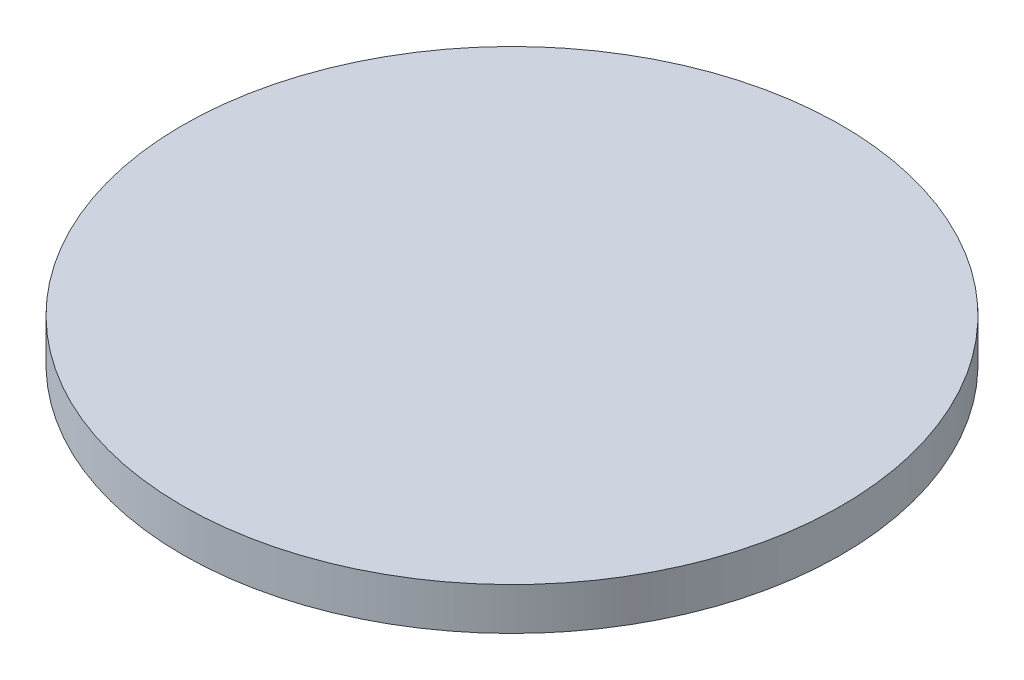
ISO-10303-21;
HEADER;
FILE_DESCRIPTION(('STEP AP214'),'2;1');
FILE_NAME('part.step','',(''),(''),'','','');
FILE_SCHEMA(('AUTOMOTIVE_DESIGN { 1 0 10303 214 1 1 1 1 }'));
ENDSEC;
DATA;
#1=APPLICATION_CONTEXT('core data for automotive mechanical design processes');
#2=APPLICATION_PROTOCOL_DEFINITION('international standard','automotive_design',2000,#1);
#3=PRODUCT_CONTEXT('',#1,'mechanical');
#4=PRODUCT('Part','Part','',(#3));
#5=PRODUCT_RELATED_PRODUCT_CATEGORY('part','',(#4));
#6=PRODUCT_DEFINITION_FORMATION('','',#4);
#7=PRODUCT_DEFINITION_CONTEXT('part definition',#1,'design');
#8=PRODUCT_DEFINITION('design','',#6,#7);
#9=PRODUCT_DEFINITION_SHAPE('','',#8);
#10=(LENGTH_UNIT() NAMED_UNIT(*) SI_UNIT(.MILLI.,.METRE.));
#11=(NAMED_UNIT(*) PLANE_ANGLE_UNIT() SI_UNIT($,.RADIAN.));
#12=(NAMED_UNIT(*) SI_UNIT($,.STERADIAN.) SOLID_ANGLE_UNIT());
#13=UNCERTAINTY_MEASURE_WITH_UNIT(LENGTH_MEASURE(1.E-05),#10,'distance_accuracy_value','');
#14=(GEOMETRIC_REPRESENTATION_CONTEXT(3) GLOBAL_UNCERTAINTY_ASSIGNED_CONTEXT((#13)) GLOBAL_UNIT_ASSIGNED_CONTEXT((#10,
#11,#12)) REPRESENTATION_CONTEXT('',''));
#15=CARTESIAN_POINT('',(0.,0.,0.));
#16=DIRECTION('',(0.,0.,1.));
#17=DIRECTION('',(1.,0.,0.));
#18=AXIS2_PLACEMENT_3D('',#15,#16,#17);
#19=CARTESIAN_POINT('',(-46.067568399222,-91.5974037358004,78.3550983298029));
#20=CARTESIAN_POINT('',(-43.5033997886585,-91.5974037358005,78.3550983298029));
#21=CARTESIAN_POINT('',(-38.3750625675316,-91.5974037358005,78.1031592775735));
#22=CARTESIAN_POINT('',(-30.7566397721519,-91.5974037358005,76.9730730087361));
#23=CARTESIAN_POINT('',(-23.2856695892558,-91.5974037358005,75.1016923979426));
#24=CARTESIAN_POINT('',(-16.0341015457524,-91.5974037358004,72.5070398634755));
#25=CARTESIAN_POINT('',(-9.07177220601088,-91.5974037358005,69.2141033276231));
#26=CARTESIAN_POINT('',(-2.46573260756944,-91.5974037358005,65.2545955693279));
#27=CARTESIAN_POINT('',(3.72039747701044,-91.5974037358004,60.6666488127894));
#28=CARTESIAN_POINT('',(9.42704223333151,-91.5974037358005,55.4944474932998));
#29=CARTESIAN_POINT('',(14.5992435528211,-91.5974037358005,49.7878027369787));
#30=CARTESIAN_POINT('',(19.1871903093596,-91.5974037358005,43.6016726523989));
#31=CARTESIAN_POINT('',(23.1466980676548,-91.5974037358004,36.9956330539574));
#32=CARTESIAN_POINT('',(26.4396346035072,-91.5974037358005,30.0333037142159));
#33=CARTESIAN_POINT('',(29.0342871379743,-91.5974037358004,22.7817356707125));
#34=CARTESIAN_POINT('',(30.9056677487678,-91.5974037358005,15.3107654878164));
#35=CARTESIAN_POINT('',(32.0357540176052,-91.5974037358005,7.69234269243668));
#36=CARTESIAN_POINT('',(32.4136625959493,-91.5974037358005,-0.00016313925369452));
#37=CARTESIAN_POINT('',(32.0357540176052,-91.5974037358005,-7.69266897094406));
#38=CARTESIAN_POINT('',(30.9056677487678,-91.5974037358005,-15.3110917663238));
#39=CARTESIAN_POINT('',(29.0342871379743,-91.5974037358005,-22.7820619492199));
#40=CARTESIAN_POINT('',(26.4396346035072,-91.5974037358005,-30.0336299927233));
#41=CARTESIAN_POINT('',(23.1466980676548,-91.5974037358005,-36.9959593324648));
#42=CARTESIAN_POINT('',(19.1871903093596,-91.5974037358005,-43.6019989309062));
#43=CARTESIAN_POINT('',(14.5992435528211,-91.5974037358005,-49.7881290154861));
#44=CARTESIAN_POINT('',(9.42704223333151,-91.5974037358005,-55.4947737718072));
#45=CARTESIAN_POINT('',(3.72039747701043,-91.5974037358005,-60.6669750912968));
#46=CARTESIAN_POINT('',(-2.46573260756941,-91.5974037358005,-65.2549218478353));
#47=CARTESIAN_POINT('',(-9.07177220601089,-91.5974037358005,-69.2144296061305));
#48=CARTESIAN_POINT('',(-16.0341015457524,-91.5974037358005,-72.5073661419829));
#49=CARTESIAN_POINT('',(-23.2856695892558,-91.5974037358005,-75.10201867645));
#50=CARTESIAN_POINT('',(-30.7566397721518,-91.5974037358005,-76.9733992872435));
#51=CARTESIAN_POINT('',(-38.3750625675316,-91.5974037358005,-78.1034855560808));
#52=CARTESIAN_POINT('',(-46.0675683992219,-91.5974037358005,-78.481394134425));
#53=CARTESIAN_POINT('',(-53.7600742309124,-91.5974037358005,-78.1034855560809));
#54=CARTESIAN_POINT('',(-61.3784970262921,-91.5974037358005,-76.9733992872435));
#55=CARTESIAN_POINT('',(-68.8494672091883,-91.5974037358004,-75.10201867645));
#56=CARTESIAN_POINT('',(-76.1010352526916,-91.5974037358005,-72.5073661419829));
#57=CARTESIAN_POINT('',(-83.0633645924331,-91.5974037358005,-69.2144296061305));
#58=CARTESIAN_POINT('',(-89.6694041908745,-91.5974037358005,-65.2549218478353));
#59=CARTESIAN_POINT('',(-95.8555342754544,-91.5974037358005,-60.6669750912968));
#60=CARTESIAN_POINT('',(-101.562179031775,-91.5974037358005,-55.4947737718072));
#61=CARTESIAN_POINT('',(-106.734380351265,-91.5974037358005,-49.7881290154861));
#62=CARTESIAN_POINT('',(-111.322327107804,-91.5974037358005,-43.6019989309063));
#63=CARTESIAN_POINT('',(-115.281834866099,-91.5974037358005,-36.9959593324649));
#64=CARTESIAN_POINT('',(-118.574771401951,-91.5974037358005,-30.0336299927233));
#65=CARTESIAN_POINT('',(-121.169423936418,-91.5974037358004,-22.78206194922));
#66=CARTESIAN_POINT('',(-123.040804547212,-91.5974037358005,-15.3110917663238));
#67=CARTESIAN_POINT('',(-124.170890816049,-91.5974037358004,-7.69266897094411));
#68=CARTESIAN_POINT('',(-124.548799394393,-91.5974037358005,-0.000163139253674746));
#69=CARTESIAN_POINT('',(-124.170890816049,-91.5974037358004,7.6923426924366));
#70=CARTESIAN_POINT('',(-123.040804547212,-91.5974037358005,15.3107654878165));
#71=CARTESIAN_POINT('',(-121.169423936418,-91.5974037358004,22.7817356707125));
#72=CARTESIAN_POINT('',(-118.574771401951,-91.5974037358005,30.033303714216));
#73=CARTESIAN_POINT('',(-115.281834866099,-91.5974037358005,36.9956330539574));
#74=CARTESIAN_POINT('',(-111.322327107804,-91.5974037358005,43.6016726523989));
#75=CARTESIAN_POINT('',(-106.734380351265,-91.5974037358004,49.7878027369787));
#76=CARTESIAN_POINT('',(-101.562179031775,-91.5974037358005,55.4944474932998));
#77=CARTESIAN_POINT('',(-95.8555342754544,-91.5974037358004,60.6666488127893));
#78=CARTESIAN_POINT('',(-89.6694041908745,-91.5974037358005,65.2545955693279));
#79=CARTESIAN_POINT('',(-83.0633645924331,-91.5974037358005,69.2141033276231));
#80=CARTESIAN_POINT('',(-76.1010352526916,-91.5974037358005,72.5070398634755));
#81=CARTESIAN_POINT('',(-68.8494672091883,-91.5974037358005,75.1016923979426));
#82=CARTESIAN_POINT('',(-61.3784970262921,-91.5974037358005,76.9730730087361));
#83=CARTESIAN_POINT('',(-53.7600742309124,-91.5974037358005,78.1031592775734));
#84=CARTESIAN_POINT('',(-48.6317370097854,-91.5974037358004,78.3550983298029));
#85=CARTESIAN_POINT('',(-46.067568399222,-91.5974037358004,78.3550983298029));
#86=B_SPLINE_CURVE_WITH_KNOTS('',3,(#19,#20,#21,#22,#23,#24,#25,#26,#27,#28,#29,#30,#31,#32,#33,
#34,#35,#36,#37,#38,#39,#40,#41,#42,#43,#44,#45,#46,#47,#48,#49,#50,#51,#52,#53,#54,#55,#56,#57,
#58,#59,#60,#61,#62,#63,#64,#65,#66,#67,#68,#69,#70,#71,#72,#73,#74,#75,#76,#77,#78,#79,#80,#81,
#82,#83,#84,#85),.UNSPECIFIED.,.T.,.F.,(4,1,1,1,1,1,1,1,1,1,1,1,1,1,1,1,1,1,1,1,1,1,1,1,1,1,1,1,
1,1,1,1,1,1,1,1,1,1,1,1,1,1,1,1,1,1,1,1,1,1,1,1,1,1,1,1,1,1,1,1,1,1,1,1,4),(0.,0.015625,0.03125,
0.046875,0.0625,0.0781250000000001,0.09375,0.109375,0.125,0.140625,0.15625,0.171875,0.1875,
0.203125,0.21875,0.234375,0.25,0.265625,0.28125,0.296875,0.3125,0.328125,0.34375,0.359375,0.375,
0.390625,0.40625,0.421875,0.4375,0.453125,0.46875,0.484375,0.5,0.515625,0.53125,0.546875,0.5625,
0.578125,0.59375,0.609375,0.625,0.640625,0.65625,0.671875,0.6875,0.703125,0.71875,0.734375,0.75,
0.765625,0.78125,0.796875,0.8125,0.828125,0.84375,0.859375,0.875,0.890625,0.90625,0.921875,
0.9375,0.953125,0.96875,0.984375,1.),.UNSPECIFIED.);
#87=DIRECTION('',(0.,1.,0.));
#88=VECTOR('',#87,1.);
#89=SURFACE_OF_LINEAR_EXTRUSION('',#86,#88);
#90=CARTESIAN_POINT('',(-46.067568399222,-91.5974037358005,78.3550983298029));
#91=CARTESIAN_POINT('',(-43.5033997886585,-91.5974037358005,78.3550983298029));
#92=CARTESIAN_POINT('',(-38.3750625675316,-91.5974037358005,78.1031592775735));
#93=CARTESIAN_POINT('',(-30.7566397721519,-91.5974037358005,76.9730730087361));
#94=CARTESIAN_POINT('',(-23.2856695892558,-91.5974037358005,75.1016923979426));
#95=CARTESIAN_POINT('',(-16.0341015457524,-91.5974037358005,72.5070398634755));
#96=CARTESIAN_POINT('',(-9.07177220601088,-91.5974037358005,69.2141033276231));
#97=CARTESIAN_POINT('',(-2.46573260756944,-91.5974037358005,65.2545955693279));
#98=CARTESIAN_POINT('',(3.72039747701044,-91.5974037358005,60.6666488127894));
#99=CARTESIAN_POINT('',(9.42704223333151,-91.5974037358005,55.4944474932998));
#100=CARTESIAN_POINT('',(14.5992435528211,-91.5974037358005,49.7878027369787));
#101=CARTESIAN_POINT('',(19.1871903093596,-91.5974037358005,43.6016726523989));
#102=CARTESIAN_POINT('',(23.1466980676548,-91.5974037358005,36.9956330539574));
#103=CARTESIAN_POINT('',(26.4396346035072,-91.5974037358005,30.0333037142159));
#104=CARTESIAN_POINT('',(29.0342871379743,-91.5974037358005,22.7817356707125));
#105=CARTESIAN_POINT('',(30.9056677487678,-91.5974037358005,15.3107654878164));
#106=CARTESIAN_POINT('',(32.0357540176052,-91.5974037358005,7.69234269243668));
#107=CARTESIAN_POINT('',(32.4136625959493,-91.5974037358005,-0.00016313925369452));
#108=CARTESIAN_POINT('',(32.0357540176052,-91.5974037358005,-7.69266897094406));
#109=CARTESIAN_POINT('',(30.9056677487678,-91.5974037358005,-15.3110917663238));
#110=CARTESIAN_POINT('',(29.0342871379743,-91.5974037358005,-22.7820619492199));
#111=CARTESIAN_POINT('',(26.4396346035072,-91.5974037358005,-30.0336299927233));
#112=CARTESIAN_POINT('',(23.1466980676548,-91.5974037358005,-36.9959593324648));
#113=CARTESIAN_POINT('',(19.1871903093596,-91.5974037358005,-43.6019989309062));
#114=CARTESIAN_POINT('',(14.5992435528211,-91.5974037358005,-49.7881290154861));
#115=CARTESIAN_POINT('',(9.42704223333151,-91.5974037358005,-55.4947737718072));
#116=CARTESIAN_POINT('',(3.72039747701043,-91.5974037358005,-60.6669750912968));
#117=CARTESIAN_POINT('',(-2.46573260756941,-91.5974037358005,-65.2549218478353));
#118=CARTESIAN_POINT('',(-9.07177220601089,-91.5974037358005,-69.2144296061305));
#119=CARTESIAN_POINT('',(-16.0341015457524,-91.5974037358005,-72.5073661419829));
#120=CARTESIAN_POINT('',(-23.2856695892558,-91.5974037358005,-75.10201867645));
#121=CARTESIAN_POINT('',(-30.7566397721518,-91.5974037358005,-76.9733992872435));
#122=CARTESIAN_POINT('',(-38.3750625675316,-91.5974037358005,-78.1034855560808));
#123=CARTESIAN_POINT('',(-46.0675683992219,-91.5974037358005,-78.481394134425));
#124=CARTESIAN_POINT('',(-53.7600742309124,-91.5974037358005,-78.1034855560809));
#125=CARTESIAN_POINT('',(-61.3784970262921,-91.5974037358005,-76.9733992872435));
#126=CARTESIAN_POINT('',(-68.8494672091883,-91.5974037358005,-75.10201867645));
#127=CARTESIAN_POINT('',(-76.1010352526916,-91.5974037358005,-72.5073661419829));
#128=CARTESIAN_POINT('',(-83.0633645924331,-91.5974037358005,-69.2144296061305));
#129=CARTESIAN_POINT('',(-89.6694041908745,-91.5974037358005,-65.2549218478353));
#130=CARTESIAN_POINT('',(-95.8555342754544,-91.5974037358005,-60.6669750912968));
#131=CARTESIAN_POINT('',(-101.562179031775,-91.5974037358005,-55.4947737718072));
#132=CARTESIAN_POINT('',(-106.734380351265,-91.5974037358005,-49.7881290154861));
#133=CARTESIAN_POINT('',(-111.322327107804,-91.5974037358005,-43.6019989309063));
#134=CARTESIAN_POINT('',(-115.281834866099,-91.5974037358005,-36.9959593324649));
#135=CARTESIAN_POINT('',(-118.574771401951,-91.5974037358005,-30.0336299927233));
#136=CARTESIAN_POINT('',(-121.169423936418,-91.5974037358005,-22.78206194922));
#137=CARTESIAN_POINT('',(-123.040804547212,-91.5974037358005,-15.3110917663238));
#138=CARTESIAN_POINT('',(-124.170890816049,-91.5974037358005,-7.69266897094411));
#139=CARTESIAN_POINT('',(-124.548799394393,-91.5974037358005,-0.000163139253674746));
#140=CARTESIAN_POINT('',(-124.170890816049,-91.5974037358005,7.6923426924366));
#141=CARTESIAN_POINT('',(-123.040804547212,-91.5974037358005,15.3107654878165));
#142=CARTESIAN_POINT('',(-121.169423936418,-91.5974037358005,22.7817356707125));
#143=CARTESIAN_POINT('',(-118.574771401951,-91.5974037358005,30.033303714216));
#144=CARTESIAN_POINT('',(-115.281834866099,-91.5974037358005,36.9956330539574));
#145=CARTESIAN_POINT('',(-111.322327107804,-91.5974037358005,43.6016726523989));
#146=CARTESIAN_POINT('',(-106.734380351265,-91.5974037358005,49.7878027369787));
#147=CARTESIAN_POINT('',(-101.562179031775,-91.5974037358005,55.4944474932998));
#148=CARTESIAN_POINT('',(-95.8555342754544,-91.5974037358005,60.6666488127893));
#149=CARTESIAN_POINT('',(-89.6694041908745,-91.5974037358005,65.2545955693279));
#150=CARTESIAN_POINT('',(-83.0633645924331,-91.5974037358005,69.2141033276231));
#151=CARTESIAN_POINT('',(-76.1010352526916,-91.5974037358005,72.5070398634755));
#152=CARTESIAN_POINT('',(-68.8494672091883,-91.5974037358005,75.1016923979426));
#153=CARTESIAN_POINT('',(-61.3784970262921,-91.5974037358005,76.9730730087361));
#154=CARTESIAN_POINT('',(-53.7600742309124,-91.5974037358005,78.1031592775734));
#155=CARTESIAN_POINT('',(-48.6317370097854,-91.5974037358005,78.3550983298029));
#156=CARTESIAN_POINT('',(-46.067568399222,-91.5974037358005,78.3550983298029));
#157=B_SPLINE_CURVE_WITH_KNOTS('',3,(#90,#91,#92,#93,#94,#95,#96,#97,#98,#99,#100,#101,#102,
#103,#104,#105,#106,#107,#108,#109,#110,#111,#112,#113,#114,#115,#116,#117,#118,#119,#120,#121,
#122,#123,#124,#125,#126,#127,#128,#129,#130,#131,#132,#133,#134,#135,#136,#137,#138,#139,#140,
#141,#142,#143,#144,#145,#146,#147,#148,#149,#150,#151,#152,#153,#154,#155,#156),.UNSPECIFIED.,
.T.,.F.,(4,1,1,1,1,1,1,1,1,1,1,1,1,1,1,1,1,1,1,1,1,1,1,1,1,1,1,1,1,1,1,1,1,1,1,1,1,1,1,1,1,1,1,
1,1,1,1,1,1,1,1,1,1,1,1,1,1,1,1,1,1,1,1,1,4),(0.,0.015625,0.03125,0.046875,0.0625,
0.0781250000000001,0.09375,0.109375,0.125,0.140625,0.15625,0.171875,0.1875,0.203125,0.21875,
0.234375,0.25,0.265625,0.28125,0.296875,0.3125,0.328125,0.34375,0.359375,0.375,0.390625,0.40625,
0.421875,0.4375,0.453125,0.46875,0.484375,0.5,0.515625,0.53125,0.546875,0.5625,0.578125,0.59375,
0.609375,0.625,0.640625,0.65625,0.671875,0.6875,0.703125,0.71875,0.734375,0.75,0.765625,0.78125,
0.796875,0.8125,0.828125,0.84375,0.859375,0.875,0.890625,0.90625,0.921875,0.9375,0.953125,
0.96875,0.984375,1.),.UNSPECIFIED.);
#158=CARTESIAN_POINT('',(-46.067568399222,-91.5974037358005,78.3550983298029));
#159=VERTEX_POINT('',#158);
#160=EDGE_CURVE('E9',#159,#159,#157,.T.);
#161=ORIENTED_EDGE('',*,*,#160,.T.);
#162=EDGE_LOOP('',(#161));
#163=FACE_BOUND('',#162,.T.);
#164=CARTESIAN_POINT('',(-46.067568399222,-81.5233733606229,78.3550983298029));
#165=CARTESIAN_POINT('',(-47.3496527045037,-81.5233733606229,78.3550983298029));
#166=CARTESIAN_POINT('',(-48.6317370097855,-81.5233733606229,78.3236059482742));
#167=CARTESIAN_POINT('',(-51.1928188271693,-81.5233733606229,78.1977880665843));
#168=CARTESIAN_POINT('',(-52.4718163392715,-81.5233733606229,78.103462566423));
#169=CARTESIAN_POINT('',(-55.0236377771165,-81.5233733606229,77.8521300918928));
#170=CARTESIAN_POINT('',(-56.2964617028594,-81.5233733606229,77.6951231175238));
#171=CARTESIAN_POINT('',(-58.8328789023121,-81.5233733606229,77.3188811674337));
#172=CARTESIAN_POINT('',(-60.0964721760219,-81.523373360623,77.0996461917126));
#173=CARTESIAN_POINT('',(-62.6113710057345,-81.523373360623,76.5994017117741));
#174=CARTESIAN_POINT('',(-63.8626765617374,-81.5233733606229,76.3183922075567));
#175=CARTESIAN_POINT('',(-66.3500020590815,-81.5233733606229,75.6953496047207));
#176=CARTESIAN_POINT('',(-67.5860220004229,-81.5233733606229,75.353316506102));
#177=CARTESIAN_POINT('',(-70.0397783714895,-81.5233733606229,74.6089776485586));
#178=CARTESIAN_POINT('',(-71.2575148012147,-81.5233733606229,74.2066718896338));
#179=CARTESIAN_POINT('',(-73.6717942922005,-81.5233733606229,73.3428288749068));
#180=CARTESIAN_POINT('',(-74.8683373534609,-81.5233733606229,72.8812916191046));
#181=CARTESIAN_POINT('',(-77.2373202506684,-81.5233733606229,71.9000267740513));
#182=CARTESIAN_POINT('',(-78.4097600866154,-81.5233733606229,71.3802991848003));
#183=CARTESIAN_POINT('',(-80.7277427399652,-81.5233733606229,70.2839750386387));
#184=CARTESIAN_POINT('',(-81.8732855573679,-81.5233733606229,69.7073784817282));
#185=CARTESIAN_POINT('',(-84.1346803803984,-81.5233733606229,68.498637766037));
#186=CARTESIAN_POINT('',(-85.2505323860262,-81.5233733606229,67.8664936072562));
#187=CARTESIAN_POINT('',(-87.4498947616499,-81.5233733606229,66.5482465304995));
#188=CARTESIAN_POINT('',(-88.5334051316459,-81.5233733606229,65.8621436125235));
#189=CARTESIAN_POINT('',(-90.6654334121495,-81.5233733606229,64.4375678600512));
#190=CARTESIAN_POINT('',(-91.713951322657,-81.5233733606229,63.6990950255549));
#191=CARTESIAN_POINT('',(-93.7735123585837,-81.5233733606229,62.1716204581792));
#192=CARTESIAN_POINT('',(-94.7845554840029,-81.5233733606229,61.3826187252998));
#193=CARTESIAN_POINT('',(-96.7666846241531,-81.5233733606229,59.7559273792951));
#194=CARTESIAN_POINT('',(-97.7377706388841,-81.5233733606229,58.9182377661698));
#195=CARTESIAN_POINT('',(-99.6376956364672,-81.523373360623,57.1962461232616));
#196=CARTESIAN_POINT('',(-100.566534619319,-81.523373360623,56.3119440934787));
#197=CARTESIAN_POINT('',(-102.379675631955,-81.523373360623,54.4988030808436));
#198=CARTESIAN_POINT('',(-103.263977661737,-81.523373360623,53.5699640979914));
#199=CARTESIAN_POINT('',(-104.985969304646,-81.5233733606229,51.6700391004082));
#200=CARTESIAN_POINT('',(-105.823658917771,-81.5233733606229,50.6989530856773));
#201=CARTESIAN_POINT('',(-107.450350263776,-81.5233733606229,48.7168239455271));
#202=CARTESIAN_POINT('',(-108.239351996655,-81.5233733606229,47.7057808201079));
#203=CARTESIAN_POINT('',(-109.766826564031,-81.5233733606229,45.6462197841812));
#204=CARTESIAN_POINT('',(-110.505299398527,-81.5233733606229,44.5977018736736));
#205=CARTESIAN_POINT('',(-111.929875150999,-81.5233733606229,42.4656735931701));
#206=CARTESIAN_POINT('',(-112.615978068975,-81.5233733606229,41.3821632231741));
#207=CARTESIAN_POINT('',(-113.934225145732,-81.5233733606229,39.1828008475503));
#208=CARTESIAN_POINT('',(-114.566369304513,-81.5233733606229,38.0669488419226));
#209=CARTESIAN_POINT('',(-115.775110020204,-81.5233733606229,35.8055540188921));
#210=CARTESIAN_POINT('',(-116.351706577115,-81.5233733606229,34.6600112014893));
#211=CARTESIAN_POINT('',(-117.448030723276,-81.5233733606229,32.3420285481396));
#212=CARTESIAN_POINT('',(-117.967758312527,-81.5233733606229,31.1695887121926));
#213=CARTESIAN_POINT('',(-118.94902315758,-81.5233733606229,28.8006058149851));
#214=CARTESIAN_POINT('',(-119.410560413383,-81.5233733606229,27.6040627537246));
#215=CARTESIAN_POINT('',(-120.27440342811,-81.5233733606229,25.1897832627389));
#216=CARTESIAN_POINT('',(-120.676709187034,-81.5233733606229,23.9720468330136));
#217=CARTESIAN_POINT('',(-121.421048044578,-81.5233733606229,21.518290461947));
#218=CARTESIAN_POINT('',(-121.763081143196,-81.5233733606229,20.2822705206057));
#219=CARTESIAN_POINT('',(-122.386123746032,-81.523373360623,17.7949450232615));
#220=CARTESIAN_POINT('',(-122.66713325025,-81.523373360623,16.5436394672587));
#221=CARTESIAN_POINT('',(-123.167377730188,-81.523373360623,14.028740637546));
#222=CARTESIAN_POINT('',(-123.386612705909,-81.5233733606229,12.7651473638362));
#223=CARTESIAN_POINT('',(-123.762854655999,-81.5233733606229,10.2287301643835));
#224=CARTESIAN_POINT('',(-123.919861630368,-81.5233733606229,8.9559062386406));
#225=CARTESIAN_POINT('',(-124.171194104899,-81.5233733606229,6.40408480079558));
#226=CARTESIAN_POINT('',(-124.26551960506,-81.5233733606229,5.12508728869346));
#227=CARTESIAN_POINT('',(-124.39133748675,-81.5233733606229,2.56400547130962));
#228=CARTESIAN_POINT('',(-124.422829868279,-81.5233733606229,1.2819211660279));
#229=CARTESIAN_POINT('',(-124.422829868279,-81.5233733606229,-1.28224744453556));
#230=CARTESIAN_POINT('',(-124.39133748675,-81.5233733606229,-2.56433174981729));
#231=CARTESIAN_POINT('',(-124.26551960506,-81.5233733606229,-5.12541356720114));
#232=CARTESIAN_POINT('',(-124.171194104899,-81.5233733606229,-6.40441107930327));
#233=CARTESIAN_POINT('',(-123.919861630368,-81.5233733606229,-8.95623251714829));
#234=CARTESIAN_POINT('',(-123.762854655999,-81.5233733606229,-10.2290564428912));
#235=CARTESIAN_POINT('',(-123.386612705909,-81.5233733606229,-12.7654736423439));
#236=CARTESIAN_POINT('',(-123.167377730188,-81.5233733606229,-14.0290669160537));
#237=CARTESIAN_POINT('',(-122.66713325025,-81.5233733606229,-16.5439657457663));
#238=CARTESIAN_POINT('',(-122.386123746032,-81.5233733606229,-17.7952713017692));
#239=CARTESIAN_POINT('',(-121.763081143196,-81.5233733606229,-20.2825967991134));
#240=CARTESIAN_POINT('',(-121.421048044578,-81.5233733606229,-21.5186167404547));
#241=CARTESIAN_POINT('',(-120.676709187034,-81.5233733606229,-23.9723731115213));
#242=CARTESIAN_POINT('',(-120.274403428109,-81.5233733606229,-25.1901095412465));
#243=CARTESIAN_POINT('',(-119.410560413382,-81.5233733606229,-27.6043890322323));
#244=CARTESIAN_POINT('',(-118.94902315758,-81.5233733606229,-28.8009320934928));
#245=CARTESIAN_POINT('',(-117.967758312527,-81.5233733606229,-31.1699149907002));
#246=CARTESIAN_POINT('',(-117.448030723276,-81.5233733606229,-32.3423548266472));
#247=CARTESIAN_POINT('',(-116.351706577114,-81.5233733606229,-34.660337479997));
#248=CARTESIAN_POINT('',(-115.775110020204,-81.5233733606229,-35.8058802973997));
#249=CARTESIAN_POINT('',(-114.566369304513,-81.5233733606229,-38.0672751204302));
#250=CARTESIAN_POINT('',(-113.934225145732,-81.5233733606229,-39.183127126058));
#251=CARTESIAN_POINT('',(-112.615978068975,-81.5233733606229,-41.3824895016817));
#252=CARTESIAN_POINT('',(-111.929875150999,-81.5233733606229,-42.4659998716777));
#253=CARTESIAN_POINT('',(-110.505299398527,-81.5233733606229,-44.5980281521812));
#254=CARTESIAN_POINT('',(-109.766826564031,-81.5233733606229,-45.6465460626888));
#255=CARTESIAN_POINT('',(-108.239351996655,-81.5233733606229,-47.7061070986155));
#256=CARTESIAN_POINT('',(-107.450350263775,-81.523373360623,-48.7171502240347));
#257=CARTESIAN_POINT('',(-105.823658917771,-81.523373360623,-50.6992793641849));
#258=CARTESIAN_POINT('',(-104.985969304646,-81.523373360623,-51.6703653789158));
#259=CARTESIAN_POINT('',(-103.263977661737,-81.523373360623,-53.570290376499));
#260=CARTESIAN_POINT('',(-102.379675631954,-81.523373360623,-54.4991293593512));
#261=CARTESIAN_POINT('',(-100.566534619319,-81.523373360623,-56.3122703719863));
#262=CARTESIAN_POINT('',(-99.637695636467,-81.523373360623,-57.1965724017692));
#263=CARTESIAN_POINT('',(-97.7377706388839,-81.523373360623,-58.9185640446774));
#264=CARTESIAN_POINT('',(-96.7666846241529,-81.523373360623,-59.7562536578027));
#265=CARTESIAN_POINT('',(-94.7845554840028,-81.523373360623,-61.3829450038074));
#266=CARTESIAN_POINT('',(-93.7735123585836,-81.523373360623,-62.1719467366868));
#267=CARTESIAN_POINT('',(-91.7139513226568,-81.523373360623,-63.6994213040624));
#268=CARTESIAN_POINT('',(-90.6654334121493,-81.523373360623,-64.4378941385587));
#269=CARTESIAN_POINT('',(-88.5334051316457,-81.523373360623,-65.862469891031));
#270=CARTESIAN_POINT('',(-87.4498947616497,-81.523373360623,-66.548572809007));
#271=CARTESIAN_POINT('',(-85.2505323860259,-81.523373360623,-67.8668198857638));
#272=CARTESIAN_POINT('',(-84.1346803803982,-81.523373360623,-68.4989640445445));
#273=CARTESIAN_POINT('',(-81.8732855573677,-81.523373360623,-69.7077047602358));
#274=CARTESIAN_POINT('',(-80.727742739965,-81.523373360623,-70.2843013171463));
#275=CARTESIAN_POINT('',(-78.4097600866152,-81.523373360623,-71.3806254633078));
#276=CARTESIAN_POINT('',(-77.2373202506682,-81.523373360623,-71.9003530525588));
#277=CARTESIAN_POINT('',(-74.8683373534607,-81.5233733606229,-72.881617897612));
#278=CARTESIAN_POINT('',(-73.6717942922002,-81.5233733606229,-73.3431551534143));
#279=CARTESIAN_POINT('',(-71.2575148012145,-81.5233733606229,-74.2069981681413));
#280=CARTESIAN_POINT('',(-70.0397783714893,-81.5233733606229,-74.6093039270661));
#281=CARTESIAN_POINT('',(-67.5860220004227,-81.5233733606229,-75.3536427846095));
#282=CARTESIAN_POINT('',(-66.3500020590814,-81.5233733606229,-75.6956758832282));
#283=CARTESIAN_POINT('',(-63.8626765617372,-81.5233733606229,-76.3187184860642));
#284=CARTESIAN_POINT('',(-62.6113710057343,-81.5233733606229,-76.5997279902816));
#285=CARTESIAN_POINT('',(-60.0964721760217,-81.5233733606229,-77.0999724702201));
#286=CARTESIAN_POINT('',(-58.8328789023119,-81.5233733606229,-77.3192074459411));
#287=CARTESIAN_POINT('',(-56.2964617028592,-81.5233733606229,-77.6954493960312));
#288=CARTESIAN_POINT('',(-55.0236377771163,-81.5233733606229,-77.8524563704002));
#289=CARTESIAN_POINT('',(-52.4718163392713,-81.5233733606229,-78.1037888449304));
#290=CARTESIAN_POINT('',(-51.1928188271692,-81.5233733606229,-78.1981143450917));
#291=CARTESIAN_POINT('',(-48.6317370097853,-81.5233733606229,-78.3239322267816));
#292=CARTESIAN_POINT('',(-47.3496527045036,-81.5233733606229,-78.3554246083103));
#293=CARTESIAN_POINT('',(-44.7854840939401,-81.5233733606229,-78.3554246083103));
#294=CARTESIAN_POINT('',(-43.5033997886584,-81.5233733606229,-78.3239322267816));
#295=CARTESIAN_POINT('',(-40.9423179712746,-81.5233733606229,-78.1981143450917));
#296=CARTESIAN_POINT('',(-39.6633204591725,-81.5233733606229,-78.1037888449304));
#297=CARTESIAN_POINT('',(-37.1114990213274,-81.5233733606229,-77.8524563704002));
#298=CARTESIAN_POINT('',(-35.8386750955845,-81.5233733606229,-77.6954493960312));
#299=CARTESIAN_POINT('',(-33.3022578961318,-81.5233733606229,-77.3192074459411));
#300=CARTESIAN_POINT('',(-32.038664622422,-81.5233733606229,-77.09997247022));
#301=CARTESIAN_POINT('',(-29.5237657927094,-81.5233733606229,-76.5997279902816));
#302=CARTESIAN_POINT('',(-28.2724602367066,-81.5233733606229,-76.3187184860642));
#303=CARTESIAN_POINT('',(-25.7851347393624,-81.5233733606229,-75.6956758832281));
#304=CARTESIAN_POINT('',(-24.5491147980211,-81.5233733606229,-75.3536427846094));
#305=CARTESIAN_POINT('',(-22.0953584269545,-81.5233733606229,-74.609303927066));
#306=CARTESIAN_POINT('',(-20.8776219972292,-81.5233733606229,-74.2069981681412));
#307=CARTESIAN_POINT('',(-18.4633425062435,-81.5233733606229,-73.3431551534142));
#308=CARTESIAN_POINT('',(-17.266799444983,-81.5233733606229,-72.8816178976119));
#309=CARTESIAN_POINT('',(-14.8978165477755,-81.5233733606229,-71.9003530525587));
#310=CARTESIAN_POINT('',(-13.7253767118285,-81.5233733606229,-71.3806254633077));
#311=CARTESIAN_POINT('',(-11.4073940584788,-81.5233733606229,-70.2843013171461));
#312=CARTESIAN_POINT('',(-10.261851241076,-81.5233733606229,-69.7077047602356));
#313=CARTESIAN_POINT('',(-8.00045641804554,-81.5233733606229,-68.4989640445444));
#314=CARTESIAN_POINT('',(-6.88460441241779,-81.5233733606229,-67.8668198857636));
#315=CARTESIAN_POINT('',(-4.68524203679404,-81.5233733606229,-66.5485728090068));
#316=CARTESIAN_POINT('',(-3.60173166679803,-81.5233733606229,-65.8624698910308));
#317=CARTESIAN_POINT('',(-1.46970338629448,-81.5233733606229,-64.4378941385585));
#318=CARTESIAN_POINT('',(-0.421185475786941,-81.5233733606229,-63.6994213040623));
#319=CARTESIAN_POINT('',(1.63837556013979,-81.5233733606229,-62.1719467366866));
#320=CARTESIAN_POINT('',(2.64941868555898,-81.5233733606229,-61.3829450038072));
#321=CARTESIAN_POINT('',(4.63154782570913,-81.5233733606229,-59.7562536578025));
#322=CARTESIAN_POINT('',(5.60263384044009,-81.5233733606229,-58.9185640446772));
#323=CARTESIAN_POINT('',(7.50255883802325,-81.5233733606229,-57.196572401769));
#324=CARTESIAN_POINT('',(8.43139782087545,-81.5233733606229,-56.3122703719861));
#325=CARTESIAN_POINT('',(10.2445388335106,-81.5233733606229,-54.499129359351));
#326=CARTESIAN_POINT('',(11.1288408632935,-81.5233733606229,-53.5702903764988));
#327=CARTESIAN_POINT('',(12.8508325062017,-81.5233733606229,-51.6703653789156));
#328=CARTESIAN_POINT('',(13.688522119327,-81.5233733606229,-50.6992793641847));
#329=CARTESIAN_POINT('',(15.3152134653317,-81.5233733606229,-48.7171502240345));
#330=CARTESIAN_POINT('',(16.104215198211,-81.5233733606229,-47.7061070986153));
#331=CARTESIAN_POINT('',(17.6316897655867,-81.5233733606229,-45.6465460626885));
#332=CARTESIAN_POINT('',(18.370162600083,-81.5233733606229,-44.598028152181));
#333=CARTESIAN_POINT('',(19.7947383525553,-81.5233733606229,-42.4659998716774));
#334=CARTESIAN_POINT('',(20.4808412705313,-81.5233733606229,-41.3824895016814));
#335=CARTESIAN_POINT('',(21.799088347288,-81.5233733606229,-39.1831271260577));
#336=CARTESIAN_POINT('',(22.4312325060688,-81.5233733606229,-38.0672751204299));
#337=CARTESIAN_POINT('',(23.6399732217601,-81.5233733606229,-35.8058802973994));
#338=CARTESIAN_POINT('',(24.2165697786706,-81.5233733606229,-34.6603374799967));
#339=CARTESIAN_POINT('',(25.3128939248321,-81.5233733606229,-32.3423548266469));
#340=CARTESIAN_POINT('',(25.8326215140831,-81.5233733606229,-31.1699149907));
#341=CARTESIAN_POINT('',(26.8138863591363,-81.5233733606229,-28.8009320934925));
#342=CARTESIAN_POINT('',(27.2754236149386,-81.5233733606229,-27.604389032232));
#343=CARTESIAN_POINT('',(28.1392666296656,-81.5233733606229,-25.1901095412462));
#344=CARTESIAN_POINT('',(28.5415723885904,-81.5233733606229,-23.972373111521));
#345=CARTESIAN_POINT('',(29.2859112461338,-81.5233733606229,-21.5186167404544));
#346=CARTESIAN_POINT('',(29.6279443447524,-81.5233733606229,-20.2825967991131));
#347=CARTESIAN_POINT('',(30.2509869475885,-81.5233733606229,-17.7952713017689));
#348=CARTESIAN_POINT('',(30.5319964518059,-81.5233733606229,-16.5439657457661));
#349=CARTESIAN_POINT('',(31.0322409317444,-81.5233733606229,-14.0290669160534));
#350=CARTESIAN_POINT('',(31.2514759074654,-81.5233733606229,-12.7654736423436));
#351=CARTESIAN_POINT('',(31.6277178575555,-81.5233733606229,-10.2290564428909));
#352=CARTESIAN_POINT('',(31.7847248319245,-81.5233733606229,-8.95623251714804));
#353=CARTESIAN_POINT('',(32.0360573064548,-81.5233733606229,-6.40441107930302));
#354=CARTESIAN_POINT('',(32.130382806616,-81.5233733606229,-5.1254135672009));
#355=CARTESIAN_POINT('',(32.2562006883059,-81.5233733606229,-2.56433174981706));
#356=CARTESIAN_POINT('',(32.2876930698346,-81.5233733606229,-1.28224744453533));
#357=CARTESIAN_POINT('',(32.2876930698346,-81.5233733606229,1.28192116602812));
#358=CARTESIAN_POINT('',(32.2562006883059,-81.5233733606229,2.56400547130984));
#359=CARTESIAN_POINT('',(32.130382806616,-81.5233733606229,5.12508728869369));
#360=CARTESIAN_POINT('',(32.0360573064548,-81.5233733606229,6.40408480079581));
#361=CARTESIAN_POINT('',(31.7847248319245,-81.523373360623,8.95590623864083));
#362=CARTESIAN_POINT('',(31.6277178575555,-81.523373360623,10.2287301643837));
#363=CARTESIAN_POINT('',(31.2514759074654,-81.523373360623,12.7651473638364));
#364=CARTESIAN_POINT('',(31.0322409317443,-81.5233733606229,14.0287406375462));
#365=CARTESIAN_POINT('',(30.5319964518059,-81.5233733606229,16.5436394672589));
#366=CARTESIAN_POINT('',(30.2509869475885,-81.5233733606229,17.7949450232617));
#367=CARTESIAN_POINT('',(29.6279443447524,-81.5233733606229,20.2822705206059));
#368=CARTESIAN_POINT('',(29.2859112461337,-81.5233733606229,21.5182904619472));
#369=CARTESIAN_POINT('',(28.5415723885903,-81.5233733606229,23.9720468330138));
#370=CARTESIAN_POINT('',(28.1392666296655,-81.5233733606229,25.189783262739));
#371=CARTESIAN_POINT('',(27.2754236149385,-81.5233733606229,27.6040627537248));
#372=CARTESIAN_POINT('',(26.8138863591363,-81.5233733606229,28.8006058149853));
#373=CARTESIAN_POINT('',(25.832621514083,-81.5233733606229,31.1695887121927));
#374=CARTESIAN_POINT('',(25.312893924832,-81.5233733606229,32.3420285481397));
#375=CARTESIAN_POINT('',(24.2165697786705,-81.5233733606229,34.6600112014895));
#376=CARTESIAN_POINT('',(23.63997322176,-81.523373360623,35.8055540188922));
#377=CARTESIAN_POINT('',(22.4312325060687,-81.5233733606229,38.0669488419227));
#378=CARTESIAN_POINT('',(21.7990883472879,-81.5233733606229,39.1828008475504));
#379=CARTESIAN_POINT('',(20.4808412705312,-81.5233733606229,41.3821632231742));
#380=CARTESIAN_POINT('',(19.7947383525552,-81.5233733606229,42.4656735931702));
#381=CARTESIAN_POINT('',(18.3701626000829,-81.523373360623,44.5977018736737));
#382=CARTESIAN_POINT('',(17.6316897655866,-81.5233733606229,45.6462197841813));
#383=CARTESIAN_POINT('',(16.1042151982109,-81.5233733606229,47.705780820108));
#384=CARTESIAN_POINT('',(15.3152134653316,-81.5233733606229,48.7168239455272));
#385=CARTESIAN_POINT('',(13.6885221193269,-81.5233733606229,50.6989530856774));
#386=CARTESIAN_POINT('',(12.8508325062016,-81.5233733606229,51.6700391004083));
#387=CARTESIAN_POINT('',(11.1288408632934,-81.5233733606229,53.5699640979915));
#388=CARTESIAN_POINT('',(10.2445388335105,-81.5233733606229,54.4988030808437));
#389=CARTESIAN_POINT('',(8.43139782087535,-81.5233733606229,56.3119440934788));
#390=CARTESIAN_POINT('',(7.50255883802315,-81.5233733606229,57.1962461232617));
#391=CARTESIAN_POINT('',(5.60263384043999,-81.5233733606229,58.9182377661699));
#392=CARTESIAN_POINT('',(4.63154782570903,-81.5233733606229,59.7559273792952));
#393=CARTESIAN_POINT('',(2.64941868555887,-81.5233733606229,61.3826187252999));
#394=CARTESIAN_POINT('',(1.63837556013968,-81.5233733606229,62.1716204581793));
#395=CARTESIAN_POINT('',(-0.421185475787065,-81.5233733606229,63.6990950255549));
#396=CARTESIAN_POINT('',(-1.46970338629461,-81.5233733606229,64.4375678600512));
#397=CARTESIAN_POINT('',(-3.60173166679816,-81.5233733606229,65.8621436125235));
#398=CARTESIAN_POINT('',(-4.68524203679417,-81.5233733606229,66.5482465304995));
#399=CARTESIAN_POINT('',(-6.88460441241792,-81.5233733606229,67.8664936072563));
#400=CARTESIAN_POINT('',(-8.00045641804566,-81.5233733606229,68.498637766037));
#401=CARTESIAN_POINT('',(-10.2618512410761,-81.5233733606229,69.7073784817283));
#402=CARTESIAN_POINT('',(-11.4073940584789,-81.5233733606229,70.2839750386388));
#403=CARTESIAN_POINT('',(-13.7253767118286,-81.5233733606229,71.3802991848003));
#404=CARTESIAN_POINT('',(-14.8978165477756,-81.5233733606229,71.9000267740513));
#405=CARTESIAN_POINT('',(-17.2667994449831,-81.5233733606229,72.8812916191046));
#406=CARTESIAN_POINT('',(-18.4633425062436,-81.5233733606229,73.3428288749068));
#407=CARTESIAN_POINT('',(-20.8776219972293,-81.5233733606229,74.2066718896338));
#408=CARTESIAN_POINT('',(-22.0953584269546,-81.5233733606229,74.6089776485586));
#409=CARTESIAN_POINT('',(-24.5491147980212,-81.5233733606229,75.353316506102));
#410=CARTESIAN_POINT('',(-25.7851347393625,-81.5233733606229,75.6953496047207));
#411=CARTESIAN_POINT('',(-28.2724602367067,-81.5233733606229,76.3183922075568));
#412=CARTESIAN_POINT('',(-29.5237657927095,-81.5233733606229,76.5994017117741));
#413=CARTESIAN_POINT('',(-32.0386646224221,-81.5233733606229,77.0996461917126));
#414=CARTESIAN_POINT('',(-33.3022578961319,-81.5233733606229,77.3188811674337));
#415=CARTESIAN_POINT('',(-35.8386750955847,-81.5233733606229,77.6951231175238));
#416=CARTESIAN_POINT('',(-37.1114990213276,-81.523373360623,77.8521300918928));
#417=CARTESIAN_POINT('',(-39.6633204591726,-81.523373360623,78.103462566423));
#418=CARTESIAN_POINT('',(-40.9423179712747,-81.523373360623,78.1977880665843));
#419=CARTESIAN_POINT('',(-43.5033997886585,-81.5233733606229,78.3236059482742));
#420=CARTESIAN_POINT('',(-44.7854840939403,-81.5233733606229,78.3550983298029));
#421=CARTESIAN_POINT('',(-46.067568399222,-81.5233733606229,78.3550983298029));
#422=B_SPLINE_CURVE_WITH_KNOTS('',3,(#164,#165,#166,#167,#168,#169,#170,#171,#172,#173,#174,
#175,#176,#177,#178,#179,#180,#181,#182,#183,#184,#185,#186,#187,#188,#189,#190,#191,#192,#193,
#194,#195,#196,#197,#198,#199,#200,#201,#202,#203,#204,#205,#206,#207,#208,#209,#210,#211,#212,
#213,#214,#215,#216,#217,#218,#219,#220,#221,#222,#223,#224,#225,#226,#227,#228,#229,#230,#231,
#232,#233,#234,#235,#236,#237,#238,#239,#240,#241,#242,#243,#244,#245,#246,#247,#248,#249,#250,
#251,#252,#253,#254,#255,#256,#257,#258,#259,#260,#261,#262,#263,#264,#265,#266,#267,#268,#269,
#270,#271,#272,#273,#274,#275,#276,#277,#278,#279,#280,#281,#282,#283,#284,#285,#286,#287,#288,
#289,#290,#291,#292,#293,#294,#295,#296,#297,#298,#299,#300,#301,#302,#303,#304,#305,#306,#307,
#308,#309,#310,#311,#312,#313,#314,#315,#316,#317,#318,#319,#320,#321,#322,#323,#324,#325,#326,
#327,#328,#329,#330,#331,#332,#333,#334,#335,#336,#337,#338,#339,#340,#341,#342,#343,#344,#345,
#346,#347,#348,#349,#350,#351,#352,#353,#354,#355,#356,#357,#358,#359,#360,#361,#362,#363,#364,
#365,#366,#367,#368,#369,#370,#371,#372,#373,#374,#375,#376,#377,#378,#379,#380,#381,#382,#383,
#384,#385,#386,#387,#388,#389,#390,#391,#392,#393,#394,#395,#396,#397,#398,#399,#400,#401,#402,
#403,#404,#405,#406,#407,#408,#409,#410,#411,#412,#413,#414,#415,#416,#417,#418,#419,#420,#421),
.UNSPECIFIED.,.F.,.F.,(4,2,2,2,2,2,2,2,2,2,2,2,2,2,2,2,2,2,2,2,2,2,2,2,2,2,2,2,2,2,2,2,2,2,2,2,
2,2,2,2,2,2,2,2,2,2,2,2,2,2,2,2,2,2,2,2,2,2,2,2,2,2,2,2,2,2,2,2,2,2,2,2,2,2,2,2,2,2,2,2,2,2,2,2,
2,2,2,2,2,2,2,2,2,2,2,2,2,2,2,2,2,2,2,2,2,2,2,2,2,2,2,2,2,2,2,2,2,2,2,2,2,2,2,2,2,2,2,2,4),(0.,
3.84586828910183,7.69173657820366,11.5376048673055,15.3834731564073,19.2293414455091,
23.0752097346109,26.9210780237127,30.7669463128145,34.6128146019163,38.4586828910181,
42.3045511801199,46.1504194692217,49.9962877583235,53.8421560474253,57.6880243365271,
61.5338926256289,65.3797609147308,69.2256292038326,73.0714974929344,76.9173657820362,
80.763234071138,84.6091023602398,88.4549706493416,92.3008389384434,96.1467072275452,
99.992575516647,103.838443805749,107.684312094851,111.530180383952,115.376048673054,
119.221916962156,123.067785251258,126.91365354036,130.759521829461,134.605390118563,
138.451258407665,142.297126696767,146.142994985869,149.98886327497,153.834731564072,
157.680599853174,161.526468142276,165.372336431378,169.21820472048,173.064073009581,
176.909941298683,180.755809587785,184.601677876887,188.447546165989,192.29341445509,
196.139282744192,199.985151033294,203.831019322396,207.676887611498,211.522755900599,
215.368624189701,219.214492478803,223.060360767905,226.906229057007,230.752097346108,
234.59796563521,238.443833924312,242.289702213414,246.135570502516,249.981438791617,
253.827307080719,257.673175369821,261.519043658923,265.364911948025,269.210780237126,
273.056648526228,276.90251681533,280.748385104432,284.594253393534,288.440121682635,
292.285989971737,296.131858260839,299.977726549941,303.823594839043,307.669463128144,
311.515331417246,315.361199706348,319.20706799545,323.052936284552,326.898804573654,
330.744672862755,334.590541151857,338.436409440959,342.282277730061,346.128146019163,
349.974014308264,353.819882597366,357.665750886468,361.51161917557,365.357487464672,
369.203355753773,373.049224042875,376.895092331977,380.740960621079,384.58682891018,
388.432697199282,392.278565488384,396.124433777486,399.970302066588,403.816170355689,
407.662038644791,411.507906933893,415.353775222995,419.199643512097,423.045511801198,
426.8913800903,430.737248379402,434.583116668504,438.428984957606,442.274853246707,
446.120721535809,449.966589824911,453.812458114013,457.658326403115,461.504194692216,
465.350062981318,469.19593127042,473.041799559522,476.887667848624,480.733536137725,
484.579404426827,488.425272715929,492.271141005031),.UNSPECIFIED.);
#423=CARTESIAN_POINT('',(-46.067568399222,-81.5233733606229,78.3550983298029));
#424=VERTEX_POINT('',#423);
#425=EDGE_CURVE('E24',#424,#424,#422,.F.);
#426=ORIENTED_EDGE('',*,*,#425,.F.);
#427=EDGE_LOOP('',(#426));
#428=FACE_BOUND('',#427,.T.);
#429=ADVANCED_FACE('F14',(#163,#428),#89,.T.);
#430=CARTESIAN_POINT('',(-122.267568399222,-91.5974037358005,-0.000163139253709122));
#431=DIRECTION('',(0.,1.,0.));
#432=DIRECTION('',(-1.,0.,0.));
#433=AXIS2_PLACEMENT_3D('',#430,#431,#432);
#434=PLANE('',#433);
#435=ORIENTED_EDGE('',*,*,#160,.F.);
#436=EDGE_LOOP('',(#435));
#437=FACE_BOUND('',#436,.T.);
#438=ADVANCED_FACE('F62',(#437),#434,.F.);
#439=CARTESIAN_POINT('',(-122.267568399222,-81.5233733606229,-0.000163139253709122));
#440=DIRECTION('',(0.,1.,0.));
#441=DIRECTION('',(-1.,0.,0.));
#442=AXIS2_PLACEMENT_3D('',#439,#440,#441);
#443=PLANE('',#442);
#444=ORIENTED_EDGE('',*,*,#425,.T.);
#445=EDGE_LOOP('',(#444));
#446=FACE_BOUND('',#445,.T.);
#447=ADVANCED_FACE('F31',(#446),#443,.T.);
#448=CLOSED_SHELL('',(#429,#438,#447));
#449=MANIFOLD_SOLID_BREP('B1',#448);
#450=ADVANCED_BREP_SHAPE_REPRESENTATION('',(#18,#449),#14);
#451=SHAPE_DEFINITION_REPRESENTATION(#9,#450);
ENDSEC;
END-ISO-10303-21;
